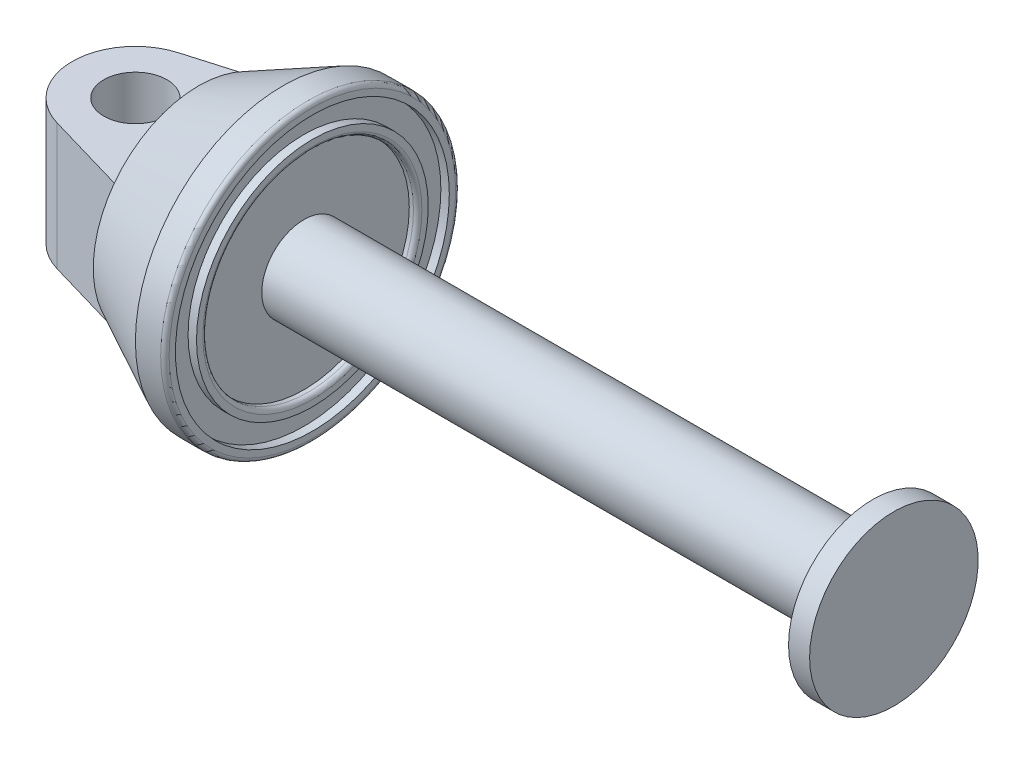
ISO-10303-21;
HEADER;
FILE_DESCRIPTION(('STEP AP214'),'2;1');
FILE_NAME('part.step','',(''),(''),'','','');
FILE_SCHEMA(('AUTOMOTIVE_DESIGN { 1 0 10303 214 1 1 1 1 }'));
ENDSEC;
DATA;
#1=APPLICATION_CONTEXT('core data for automotive mechanical design processes');
#2=APPLICATION_PROTOCOL_DEFINITION('international standard','automotive_design',2000,#1);
#3=PRODUCT_CONTEXT('',#1,'mechanical');
#4=PRODUCT('Part','Part','',(#3));
#5=PRODUCT_RELATED_PRODUCT_CATEGORY('part','',(#4));
#6=PRODUCT_DEFINITION_FORMATION('','',#4);
#7=PRODUCT_DEFINITION_CONTEXT('part definition',#1,'design');
#8=PRODUCT_DEFINITION('design','',#6,#7);
#9=PRODUCT_DEFINITION_SHAPE('','',#8);
#10=(LENGTH_UNIT() NAMED_UNIT(*) SI_UNIT(.MILLI.,.METRE.));
#11=(NAMED_UNIT(*) PLANE_ANGLE_UNIT() SI_UNIT($,.RADIAN.));
#12=(NAMED_UNIT(*) SI_UNIT($,.STERADIAN.) SOLID_ANGLE_UNIT());
#13=UNCERTAINTY_MEASURE_WITH_UNIT(LENGTH_MEASURE(1.E-05),#10,'distance_accuracy_value','');
#14=(GEOMETRIC_REPRESENTATION_CONTEXT(3) GLOBAL_UNCERTAINTY_ASSIGNED_CONTEXT((#13)) GLOBAL_UNIT_ASSIGNED_CONTEXT((#10,
#11,#12)) REPRESENTATION_CONTEXT('',''));
#15=CARTESIAN_POINT('',(0.,0.,0.));
#16=DIRECTION('',(0.,0.,1.));
#17=DIRECTION('',(1.,0.,0.));
#18=AXIS2_PLACEMENT_3D('',#15,#16,#17);
#19=CARTESIAN_POINT('',(-46.25,0.,-12.5));
#20=DIRECTION('',(1.,0.,0.));
#21=DIRECTION('',(0.,0.,-1.));
#22=AXIS2_PLACEMENT_3D('',#19,#20,#21);
#23=PLANE('',#22);
#24=DIRECTION('',(0.,-1.,0.));
#25=VECTOR('',#24,1.);
#26=CARTESIAN_POINT('',(-46.25,7.5,-10.));
#27=LINE('',#26,#25);
#28=CARTESIAN_POINT('',(-46.25,7.5,-10.));
#29=VERTEX_POINT('',#28);
#30=CARTESIAN_POINT('',(-46.25,-7.5,-10.));
#31=VERTEX_POINT('',#30);
#32=EDGE_CURVE('E85',#29,#31,#27,.T.);
#33=ORIENTED_EDGE('',*,*,#32,.F.);
#34=CARTESIAN_POINT('',(-46.25,0.,0.));
#35=DIRECTION('',(-1.,0.,0.));
#36=DIRECTION('',(0.,0.,1.));
#37=AXIS2_PLACEMENT_3D('',#34,#35,#36);
#38=CIRCLE('',#37,12.5);
#39=EDGE_CURVE('E157',#29,#31,#38,.T.);
#40=ORIENTED_EDGE('',*,*,#39,.T.);
#41=EDGE_LOOP('',(#33,#40));
#42=FACE_BOUND('',#41,.T.);
#43=ADVANCED_FACE('F44',(#42),#23,.F.);
#44=DIRECTION('',(0.,0.,-1.));
#45=VECTOR('',#44,1.);
#46=CARTESIAN_POINT('',(-46.25,7.5,-10.));
#47=LINE('',#46,#45);
#48=CARTESIAN_POINT('',(-46.25,7.5,10.));
#49=VERTEX_POINT('',#48);
#50=EDGE_CURVE('E68',#49,#29,#47,.T.);
#51=ORIENTED_EDGE('',*,*,#50,.F.);
#52=EDGE_CURVE('E153',#49,#29,#38,.T.);
#53=ORIENTED_EDGE('',*,*,#52,.T.);
#54=EDGE_LOOP('',(#51,#53));
#55=FACE_BOUND('',#54,.T.);
#56=ADVANCED_FACE('F184',(#55),#23,.F.);
#57=CARTESIAN_POINT('',(-46.25,-7.5,10.));
#58=VERTEX_POINT('',#57);
#59=EDGE_CURVE('E217',#31,#58,#38,.T.);
#60=ORIENTED_EDGE('',*,*,#59,.T.);
#61=DIRECTION('',(0.,0.,-1.));
#62=VECTOR('',#61,1.);
#63=CARTESIAN_POINT('',(-46.25,-7.5,-10.));
#64=LINE('',#63,#62);
#65=EDGE_CURVE('E59',#58,#31,#64,.T.);
#66=ORIENTED_EDGE('',*,*,#65,.T.);
#67=EDGE_LOOP('',(#60,#66));
#68=FACE_BOUND('',#67,.T.);
#69=ADVANCED_FACE('F191',(#68),#23,.F.);
#70=CARTESIAN_POINT('',(-33.75,0.,-17.5));
#71=DIRECTION('',(-1.,0.,0.));
#72=DIRECTION('',(0.,0.,1.));
#73=AXIS2_PLACEMENT_3D('',#70,#71,#72);
#74=PLANE('',#73);
#75=CARTESIAN_POINT('',(-33.75,0.,0.));
#76=DIRECTION('',(-1.,0.,0.));
#77=DIRECTION('',(0.,0.,1.));
#78=AXIS2_PLACEMENT_3D('',#75,#76,#77);
#79=CIRCLE('',#78,13.75);
#80=CARTESIAN_POINT('',(-33.75,0.,13.75));
#81=VERTEX_POINT('',#80);
#82=EDGE_CURVE('E156',#81,#81,#79,.F.);
#83=ORIENTED_EDGE('',*,*,#82,.F.);
#84=EDGE_LOOP('',(#83));
#85=FACE_BOUND('',#84,.T.);
#86=CARTESIAN_POINT('',(-33.75,0.,0.));
#87=DIRECTION('',(1.,0.,0.));
#88=DIRECTION('',(0.,0.,-1.));
#89=AXIS2_PLACEMENT_3D('',#86,#87,#88);
#90=CIRCLE('',#89,16.25);
#91=CARTESIAN_POINT('',(-33.75,0.,-16.25));
#92=VERTEX_POINT('',#91);
#93=EDGE_CURVE('E129',#92,#92,#90,.T.);
#94=ORIENTED_EDGE('',*,*,#93,.T.);
#95=EDGE_LOOP('',(#94));
#96=FACE_BOUND('',#95,.T.);
#97=ADVANCED_FACE('F208',(#85,#96),#74,.F.);
#98=CARTESIAN_POINT('',(-32.75,0.,0.));
#99=DIRECTION('',(-1.,0.,0.));
#100=DIRECTION('',(0.,0.,1.));
#101=AXIS2_PLACEMENT_3D('',#98,#99,#100);
#102=CYLINDRICAL_SURFACE('',#101,16.25);
#103=CARTESIAN_POINT('',(-32.75,0.,0.));
#104=DIRECTION('',(1.,0.,0.));
#105=DIRECTION('',(0.,0.,-1.));
#106=AXIS2_PLACEMENT_3D('',#103,#104,#105);
#107=CIRCLE('',#106,16.25);
#108=CARTESIAN_POINT('',(-32.75,0.,-16.25));
#109=VERTEX_POINT('',#108);
#110=EDGE_CURVE('E132',#109,#109,#107,.T.);
#111=ORIENTED_EDGE('',*,*,#110,.T.);
#112=EDGE_LOOP('',(#111));
#113=FACE_BOUND('',#112,.T.);
#114=ORIENTED_EDGE('',*,*,#93,.F.);
#115=EDGE_LOOP('',(#114));
#116=FACE_BOUND('',#115,.T.);
#117=ADVANCED_FACE('F204',(#113,#116),#102,.F.);
#118=CARTESIAN_POINT('',(-32.75,0.,0.));
#119=DIRECTION('',(1.,0.,0.));
#120=DIRECTION('',(0.,0.,-1.));
#121=AXIS2_PLACEMENT_3D('',#118,#119,#120);
#122=PLANE('',#121);
#123=CARTESIAN_POINT('',(-32.75,0.,0.));
#124=DIRECTION('',(1.,0.,0.));
#125=DIRECTION('',(0.,0.,-1.));
#126=AXIS2_PLACEMENT_3D('',#123,#124,#125);
#127=CIRCLE('',#126,17.);
#128=CARTESIAN_POINT('',(-32.75,0.,-17.));
#129=VERTEX_POINT('',#128);
#130=EDGE_CURVE('E52',#129,#129,#127,.T.);
#131=ORIENTED_EDGE('',*,*,#130,.T.);
#132=EDGE_LOOP('',(#131));
#133=FACE_BOUND('',#132,.T.);
#134=ORIENTED_EDGE('',*,*,#110,.F.);
#135=EDGE_LOOP('',(#134));
#136=FACE_BOUND('',#135,.T.);
#137=ADVANCED_FACE('F168',(#133,#136),#122,.T.);
#138=EDGE_CURVE('E152',#58,#49,#38,.T.);
#139=ORIENTED_EDGE('',*,*,#138,.T.);
#140=DIRECTION('',(0.,-1.,0.));
#141=VECTOR('',#140,1.);
#142=CARTESIAN_POINT('',(-46.25,7.5,10.));
#143=LINE('',#142,#141);
#144=EDGE_CURVE('E107',#49,#58,#143,.T.);
#145=ORIENTED_EDGE('',*,*,#144,.T.);
#146=EDGE_LOOP('',(#139,#145));
#147=FACE_BOUND('',#146,.T.);
#148=ADVANCED_FACE('F187',(#147),#23,.F.);
#149=CARTESIAN_POINT('',(-36.25,0.,0.));
#150=DIRECTION('',(1.,0.,0.));
#151=DIRECTION('',(0.,0.,-1.));
#152=AXIS2_PLACEMENT_3D('',#149,#150,#151);
#153=CONICAL_SURFACE('',#152,17.5,0.463647609000806);
#154=ORIENTED_EDGE('',*,*,#52,.F.);
#155=ORIENTED_EDGE('',*,*,#138,.F.);
#156=ORIENTED_EDGE('',*,*,#59,.F.);
#157=ORIENTED_EDGE('',*,*,#39,.F.);
#158=EDGE_LOOP('',(#154,#155,#156,#157));
#159=FACE_BOUND('',#158,.T.);
#160=CARTESIAN_POINT('',(-36.25,0.,0.));
#161=DIRECTION('',(-1.,0.,0.));
#162=DIRECTION('',(0.,0.,1.));
#163=AXIS2_PLACEMENT_3D('',#160,#161,#162);
#164=CIRCLE('',#163,17.5);
#165=CARTESIAN_POINT('',(-36.25,0.,17.5));
#166=VERTEX_POINT('',#165);
#167=EDGE_CURVE('E135',#166,#166,#164,.T.);
#168=ORIENTED_EDGE('',*,*,#167,.T.);
#169=EDGE_LOOP('',(#168));
#170=FACE_BOUND('',#169,.T.);
#171=ADVANCED_FACE('F196',(#159,#170),#153,.T.);
#172=CARTESIAN_POINT('',(-36.25,0.,0.));
#173=DIRECTION('',(-1.,0.,0.));
#174=DIRECTION('',(0.,0.,1.));
#175=AXIS2_PLACEMENT_3D('',#172,#173,#174);
#176=CYLINDRICAL_SURFACE('',#175,17.5);
#177=CARTESIAN_POINT('',(-33.25,0.,0.));
#178=DIRECTION('',(1.,0.,0.));
#179=DIRECTION('',(0.,0.,-1.));
#180=AXIS2_PLACEMENT_3D('',#177,#178,#179);
#181=CIRCLE('',#180,17.5);
#182=CARTESIAN_POINT('',(-33.25,0.,-17.5));
#183=VERTEX_POINT('',#182);
#184=EDGE_CURVE('E12',#183,#183,#181,.F.);
#185=ORIENTED_EDGE('',*,*,#184,.T.);
#186=EDGE_LOOP('',(#185));
#187=FACE_BOUND('',#186,.T.);
#188=ORIENTED_EDGE('',*,*,#167,.F.);
#189=EDGE_LOOP('',(#188));
#190=FACE_BOUND('',#189,.T.);
#191=ADVANCED_FACE('F202',(#187,#190),#176,.T.);
#192=CARTESIAN_POINT('',(-32.75,0.,0.));
#193=DIRECTION('',(-1.,0.,0.));
#194=DIRECTION('',(0.,0.,1.));
#195=AXIS2_PLACEMENT_3D('',#192,#193,#194);
#196=CYLINDRICAL_SURFACE('',#195,12.5);
#197=CARTESIAN_POINT('',(-33.25,0.,0.));
#198=DIRECTION('',(1.,0.,0.));
#199=DIRECTION('',(0.,0.,-1.));
#200=AXIS2_PLACEMENT_3D('',#197,#198,#199);
#201=CIRCLE('',#200,12.5);
#202=CARTESIAN_POINT('',(-33.25,0.,-12.5));
#203=VERTEX_POINT('',#202);
#204=EDGE_CURVE('E160',#203,#203,#201,.T.);
#205=ORIENTED_EDGE('',*,*,#204,.T.);
#206=EDGE_LOOP('',(#205));
#207=FACE_BOUND('',#206,.T.);
#208=CARTESIAN_POINT('',(-33.75,0.,0.));
#209=DIRECTION('',(1.,0.,0.));
#210=DIRECTION('',(0.,0.,-1.));
#211=AXIS2_PLACEMENT_3D('',#208,#209,#210);
#212=CIRCLE('',#211,12.5);
#213=CARTESIAN_POINT('',(-33.75,0.,-12.5));
#214=VERTEX_POINT('',#213);
#215=EDGE_CURVE('E125',#214,#214,#212,.T.);
#216=ORIENTED_EDGE('',*,*,#215,.F.);
#217=EDGE_LOOP('',(#216));
#218=FACE_BOUND('',#217,.T.);
#219=ADVANCED_FACE('F226',(#207,#218),#196,.F.);
#220=CARTESIAN_POINT('',(-32.75,0.,0.));
#221=DIRECTION('',(-1.,0.,0.));
#222=DIRECTION('',(0.,0.,1.));
#223=AXIS2_PLACEMENT_3D('',#220,#221,#222);
#224=CYLINDRICAL_SURFACE('',#223,13.75);
#225=CARTESIAN_POINT('',(-32.75,0.,0.));
#226=DIRECTION('',(1.,0.,0.));
#227=DIRECTION('',(0.,0.,-1.));
#228=AXIS2_PLACEMENT_3D('',#225,#226,#227);
#229=CIRCLE('',#228,13.75);
#230=CARTESIAN_POINT('',(-32.75,0.,-13.75));
#231=VERTEX_POINT('',#230);
#232=EDGE_CURVE('E126',#231,#231,#229,.T.);
#233=ORIENTED_EDGE('',*,*,#232,.F.);
#234=EDGE_LOOP('',(#233));
#235=FACE_BOUND('',#234,.T.);
#236=ORIENTED_EDGE('',*,*,#82,.T.);
#237=EDGE_LOOP('',(#236));
#238=FACE_BOUND('',#237,.T.);
#239=ADVANCED_FACE('F232',(#235,#238),#224,.T.);
#240=CARTESIAN_POINT('',(-32.75,0.,0.));
#241=DIRECTION('',(1.,0.,0.));
#242=DIRECTION('',(0.,0.,-1.));
#243=AXIS2_PLACEMENT_3D('',#240,#241,#242);
#244=PLANE('',#243);
#245=CARTESIAN_POINT('',(-32.75,0.,0.));
#246=DIRECTION('',(1.,0.,0.));
#247=DIRECTION('',(0.,0.,-1.));
#248=AXIS2_PLACEMENT_3D('',#245,#246,#247);
#249=CIRCLE('',#248,13.);
#250=CARTESIAN_POINT('',(-32.75,0.,-13.));
#251=VERTEX_POINT('',#250);
#252=EDGE_CURVE('E163',#251,#251,#249,.F.);
#253=ORIENTED_EDGE('',*,*,#252,.T.);
#254=EDGE_LOOP('',(#253));
#255=FACE_BOUND('',#254,.T.);
#256=ORIENTED_EDGE('',*,*,#232,.T.);
#257=EDGE_LOOP('',(#256));
#258=FACE_BOUND('',#257,.T.);
#259=ADVANCED_FACE('F250',(#255,#258),#244,.T.);
#260=CARTESIAN_POINT('',(36.25,0.,-10.));
#261=DIRECTION('',(-1.,0.,0.));
#262=DIRECTION('',(0.,0.,1.));
#263=AXIS2_PLACEMENT_3D('',#260,#261,#262);
#264=PLANE('',#263);
#265=CARTESIAN_POINT('',(36.25,0.,0.));
#266=DIRECTION('',(-1.,0.,0.));
#267=DIRECTION('',(0.,0.,1.));
#268=AXIS2_PLACEMENT_3D('',#265,#266,#267);
#269=CIRCLE('',#268,10.);
#270=CARTESIAN_POINT('',(36.25,0.,10.));
#271=VERTEX_POINT('',#270);
#272=EDGE_CURVE('E149',#271,#271,#269,.T.);
#273=ORIENTED_EDGE('',*,*,#272,.F.);
#274=EDGE_LOOP('',(#273));
#275=FACE_BOUND('',#274,.T.);
#276=ADVANCED_FACE('F247',(#275),#264,.F.);
#277=CARTESIAN_POINT('',(-36.25,0.,0.));
#278=DIRECTION('',(-1.,0.,0.));
#279=DIRECTION('',(0.,0.,1.));
#280=AXIS2_PLACEMENT_3D('',#277,#278,#279);
#281=CYLINDRICAL_SURFACE('',#280,10.);
#282=CARTESIAN_POINT('',(33.75,0.,0.));
#283=DIRECTION('',(-1.,0.,0.));
#284=DIRECTION('',(0.,0.,1.));
#285=AXIS2_PLACEMENT_3D('',#282,#283,#284);
#286=CIRCLE('',#285,10.);
#287=CARTESIAN_POINT('',(33.75,0.,10.));
#288=VERTEX_POINT('',#287);
#289=EDGE_CURVE('E146',#288,#288,#286,.T.);
#290=ORIENTED_EDGE('',*,*,#289,.F.);
#291=EDGE_LOOP('',(#290));
#292=FACE_BOUND('',#291,.T.);
#293=ORIENTED_EDGE('',*,*,#272,.T.);
#294=EDGE_LOOP('',(#293));
#295=FACE_BOUND('',#294,.T.);
#296=ADVANCED_FACE('F244',(#292,#295),#281,.T.);
#297=CARTESIAN_POINT('',(33.75,0.,-5.));
#298=DIRECTION('',(1.,0.,0.));
#299=DIRECTION('',(0.,0.,-1.));
#300=AXIS2_PLACEMENT_3D('',#297,#298,#299);
#301=PLANE('',#300);
#302=CARTESIAN_POINT('',(33.75,0.,0.));
#303=DIRECTION('',(-1.,0.,0.));
#304=DIRECTION('',(0.,0.,1.));
#305=AXIS2_PLACEMENT_3D('',#302,#303,#304);
#306=CIRCLE('',#305,5.);
#307=CARTESIAN_POINT('',(33.75,0.,5.));
#308=VERTEX_POINT('',#307);
#309=EDGE_CURVE('E143',#308,#308,#306,.T.);
#310=ORIENTED_EDGE('',*,*,#309,.F.);
#311=EDGE_LOOP('',(#310));
#312=FACE_BOUND('',#311,.T.);
#313=ORIENTED_EDGE('',*,*,#289,.T.);
#314=EDGE_LOOP('',(#313));
#315=FACE_BOUND('',#314,.T.);
#316=ADVANCED_FACE('F240',(#312,#315),#301,.F.);
#317=CARTESIAN_POINT('',(-36.25,0.,0.));
#318=DIRECTION('',(-1.,0.,0.));
#319=DIRECTION('',(0.,0.,1.));
#320=AXIS2_PLACEMENT_3D('',#317,#318,#319);
#321=CYLINDRICAL_SURFACE('',#320,5.);
#322=CARTESIAN_POINT('',(-33.75,0.,0.));
#323=DIRECTION('',(-1.,0.,0.));
#324=DIRECTION('',(0.,0.,1.));
#325=AXIS2_PLACEMENT_3D('',#322,#323,#324);
#326=CIRCLE('',#325,5.);
#327=CARTESIAN_POINT('',(-33.75,0.,5.));
#328=VERTEX_POINT('',#327);
#329=EDGE_CURVE('E140',#328,#328,#326,.T.);
#330=ORIENTED_EDGE('',*,*,#329,.F.);
#331=EDGE_LOOP('',(#330));
#332=FACE_BOUND('',#331,.T.);
#333=ORIENTED_EDGE('',*,*,#309,.T.);
#334=EDGE_LOOP('',(#333));
#335=FACE_BOUND('',#334,.T.);
#336=ADVANCED_FACE('F237',(#332,#335),#321,.T.);
#337=ORIENTED_EDGE('',*,*,#329,.T.);
#338=EDGE_LOOP('',(#337));
#339=FACE_BOUND('',#338,.T.);
#340=ORIENTED_EDGE('',*,*,#215,.T.);
#341=EDGE_LOOP('',(#340));
#342=FACE_BOUND('',#341,.T.);
#343=ADVANCED_FACE('F180',(#339,#342),#74,.F.);
#344=CARTESIAN_POINT('',(-33.25,0.,0.));
#345=DIRECTION('',(1.,0.,0.));
#346=DIRECTION('',(0.,0.,-1.));
#347=AXIS2_PLACEMENT_3D('',#344,#345,#346);
#348=TOROIDAL_SURFACE('',#347,13.,0.5);
#349=ORIENTED_EDGE('',*,*,#252,.F.);
#350=EDGE_LOOP('',(#349));
#351=FACE_BOUND('',#350,.T.);
#352=ORIENTED_EDGE('',*,*,#204,.F.);
#353=EDGE_LOOP('',(#352));
#354=FACE_BOUND('',#353,.T.);
#355=ADVANCED_FACE('F172',(#351,#354),#348,.T.);
#356=CARTESIAN_POINT('',(-33.25,0.,0.));
#357=DIRECTION('',(1.,0.,0.));
#358=DIRECTION('',(0.,0.,-1.));
#359=AXIS2_PLACEMENT_3D('',#356,#357,#358);
#360=TOROIDAL_SURFACE('',#359,17.,0.5);
#361=ORIENTED_EDGE('',*,*,#184,.F.);
#362=EDGE_LOOP('',(#361));
#363=FACE_BOUND('',#362,.T.);
#364=ORIENTED_EDGE('',*,*,#130,.F.);
#365=EDGE_LOOP('',(#364));
#366=FACE_BOUND('',#365,.T.);
#367=ADVANCED_FACE('F46',(#363,#366),#360,.T.);
#368=CARTESIAN_POINT('',(-53.75,7.5,0.));
#369=DIRECTION('',(0.,1.,0.));
#370=DIRECTION('',(0.,0.,1.));
#371=AXIS2_PLACEMENT_3D('',#368,#369,#370);
#372=PLANE('',#371);
#373=DIRECTION('',(-0.96,0.,0.28));
#374=VECTOR('',#373,1.);
#375=CARTESIAN_POINT('',(-55.85,7.5,-7.2));
#376=LINE('',#375,#374);
#377=CARTESIAN_POINT('',(-55.85,7.5,-7.2));
#378=VERTEX_POINT('',#377);
#379=EDGE_CURVE('E98',#29,#378,#376,.T.);
#380=ORIENTED_EDGE('',*,*,#379,.T.);
#381=CARTESIAN_POINT('',(-53.75,7.5,0.));
#382=DIRECTION('',(0.,1.,0.));
#383=DIRECTION('',(0.,0.,1.));
#384=AXIS2_PLACEMENT_3D('',#381,#382,#383);
#385=CIRCLE('',#384,7.5);
#386=CARTESIAN_POINT('',(-55.85,7.5,7.2));
#387=VERTEX_POINT('',#386);
#388=EDGE_CURVE('E92',#378,#387,#385,.T.);
#389=ORIENTED_EDGE('',*,*,#388,.T.);
#390=DIRECTION('',(0.96,0.,0.28));
#391=VECTOR('',#390,1.);
#392=CARTESIAN_POINT('',(-46.25,7.5,10.));
#393=LINE('',#392,#391);
#394=EDGE_CURVE('E96',#387,#49,#393,.T.);
#395=ORIENTED_EDGE('',*,*,#394,.T.);
#396=ORIENTED_EDGE('',*,*,#50,.T.);
#397=EDGE_LOOP('',(#380,#389,#395,#396));
#398=FACE_BOUND('',#397,.T.);
#399=CARTESIAN_POINT('',(-53.75,7.5,0.));
#400=DIRECTION('',(0.,1.,0.));
#401=DIRECTION('',(0.,0.,1.));
#402=AXIS2_PLACEMENT_3D('',#399,#400,#401);
#403=CIRCLE('',#402,3.75);
#404=CARTESIAN_POINT('',(-53.75,7.5,3.75));
#405=VERTEX_POINT('',#404);
#406=EDGE_CURVE('E117',#405,#405,#403,.T.);
#407=ORIENTED_EDGE('',*,*,#406,.F.);
#408=EDGE_LOOP('',(#407));
#409=FACE_BOUND('',#408,.T.);
#410=ADVANCED_FACE('F93',(#398,#409),#372,.T.);
#411=CARTESIAN_POINT('',(-53.75,-7.5,0.));
#412=DIRECTION('',(0.,1.,0.));
#413=DIRECTION('',(0.,0.,1.));
#414=AXIS2_PLACEMENT_3D('',#411,#412,#413);
#415=PLANE('',#414);
#416=DIRECTION('',(-0.96,0.,0.28));
#417=VECTOR('',#416,1.);
#418=CARTESIAN_POINT('',(-55.85,-7.5,-7.2));
#419=LINE('',#418,#417);
#420=CARTESIAN_POINT('',(-55.85,-7.5,-7.2));
#421=VERTEX_POINT('',#420);
#422=EDGE_CURVE('E115',#31,#421,#419,.T.);
#423=ORIENTED_EDGE('',*,*,#422,.F.);
#424=ORIENTED_EDGE('',*,*,#65,.F.);
#425=DIRECTION('',(0.96,0.,0.28));
#426=VECTOR('',#425,1.);
#427=CARTESIAN_POINT('',(-46.25,-7.5,10.));
#428=LINE('',#427,#426);
#429=CARTESIAN_POINT('',(-55.85,-7.5,7.2));
#430=VERTEX_POINT('',#429);
#431=EDGE_CURVE('E119',#430,#58,#428,.T.);
#432=ORIENTED_EDGE('',*,*,#431,.F.);
#433=CARTESIAN_POINT('',(-53.75,-7.5,0.));
#434=DIRECTION('',(0.,1.,0.));
#435=DIRECTION('',(0.,0.,1.));
#436=AXIS2_PLACEMENT_3D('',#433,#434,#435);
#437=CIRCLE('',#436,7.5);
#438=EDGE_CURVE('E104',#421,#430,#437,.T.);
#439=ORIENTED_EDGE('',*,*,#438,.F.);
#440=EDGE_LOOP('',(#423,#424,#432,#439));
#441=FACE_BOUND('',#440,.T.);
#442=CARTESIAN_POINT('',(-53.75,-7.5,0.));
#443=DIRECTION('',(0.,1.,0.));
#444=DIRECTION('',(0.,0.,1.));
#445=AXIS2_PLACEMENT_3D('',#442,#443,#444);
#446=CIRCLE('',#445,3.75);
#447=CARTESIAN_POINT('',(-53.75,-7.5,3.75));
#448=VERTEX_POINT('',#447);
#449=EDGE_CURVE('E285',#448,#448,#446,.T.);
#450=ORIENTED_EDGE('',*,*,#449,.T.);
#451=EDGE_LOOP('',(#450));
#452=FACE_BOUND('',#451,.T.);
#453=ADVANCED_FACE('F178',(#441,#452),#415,.F.);
#454=CARTESIAN_POINT('',(-55.85,7.5,-7.2));
#455=DIRECTION('',(0.28,0.,0.96));
#456=DIRECTION('',(0.96,0.,-0.28));
#457=AXIS2_PLACEMENT_3D('',#454,#455,#456);
#458=PLANE('',#457);
#459=ORIENTED_EDGE('',*,*,#422,.T.);
#460=DIRECTION('',(0.,-1.,0.));
#461=VECTOR('',#460,1.);
#462=CARTESIAN_POINT('',(-55.85,7.5,-7.2));
#463=LINE('',#462,#461);
#464=EDGE_CURVE('E106',#378,#421,#463,.T.);
#465=ORIENTED_EDGE('',*,*,#464,.F.);
#466=ORIENTED_EDGE('',*,*,#379,.F.);
#467=ORIENTED_EDGE('',*,*,#32,.T.);
#468=EDGE_LOOP('',(#459,#465,#466,#467));
#469=FACE_BOUND('',#468,.T.);
#470=ADVANCED_FACE('F266',(#469),#458,.F.);
#471=CARTESIAN_POINT('',(-53.75,7.5,0.));
#472=DIRECTION('',(0.,-1.,0.));
#473=DIRECTION('',(0.,0.,-1.));
#474=AXIS2_PLACEMENT_3D('',#471,#472,#473);
#475=CYLINDRICAL_SURFACE('',#474,7.5);
#476=ORIENTED_EDGE('',*,*,#438,.T.);
#477=DIRECTION('',(0.,-1.,0.));
#478=VECTOR('',#477,1.);
#479=CARTESIAN_POINT('',(-55.85,7.5,7.2));
#480=LINE('',#479,#478);
#481=EDGE_CURVE('E102',#387,#430,#480,.T.);
#482=ORIENTED_EDGE('',*,*,#481,.F.);
#483=ORIENTED_EDGE('',*,*,#388,.F.);
#484=ORIENTED_EDGE('',*,*,#464,.T.);
#485=EDGE_LOOP('',(#476,#482,#483,#484));
#486=FACE_BOUND('',#485,.T.);
#487=ADVANCED_FACE('F103',(#486),#475,.T.);
#488=CARTESIAN_POINT('',(-46.25,7.5,10.));
#489=DIRECTION('',(0.28,0.,-0.96));
#490=DIRECTION('',(-0.96,0.,-0.28));
#491=AXIS2_PLACEMENT_3D('',#488,#489,#490);
#492=PLANE('',#491);
#493=ORIENTED_EDGE('',*,*,#431,.T.);
#494=ORIENTED_EDGE('',*,*,#144,.F.);
#495=ORIENTED_EDGE('',*,*,#394,.F.);
#496=ORIENTED_EDGE('',*,*,#481,.T.);
#497=EDGE_LOOP('',(#493,#494,#495,#496));
#498=FACE_BOUND('',#497,.T.);
#499=ADVANCED_FACE('F109',(#498),#492,.F.);
#500=CARTESIAN_POINT('',(-53.75,7.5,0.));
#501=DIRECTION('',(0.,-1.,0.));
#502=DIRECTION('',(0.,0.,-1.));
#503=AXIS2_PLACEMENT_3D('',#500,#501,#502);
#504=CYLINDRICAL_SURFACE('',#503,3.75);
#505=ORIENTED_EDGE('',*,*,#406,.T.);
#506=EDGE_LOOP('',(#505));
#507=FACE_BOUND('',#506,.T.);
#508=ORIENTED_EDGE('',*,*,#449,.F.);
#509=EDGE_LOOP('',(#508));
#510=FACE_BOUND('',#509,.T.);
#511=ADVANCED_FACE('F273',(#507,#510),#504,.F.);
#512=CLOSED_SHELL('',(#43,#56,#69,#97,#117,#137,#148,#171,#191,#219,#239,#259,#276,#296,#316,
#336,#343,#355,#367,#410,#453,#470,#487,#499,#511));
#513=MANIFOLD_SOLID_BREP('B2',#512);
#514=ADVANCED_BREP_SHAPE_REPRESENTATION('',(#18,#513),#14);
#515=SHAPE_DEFINITION_REPRESENTATION(#9,#514);
ENDSEC;
END-ISO-10303-21;
